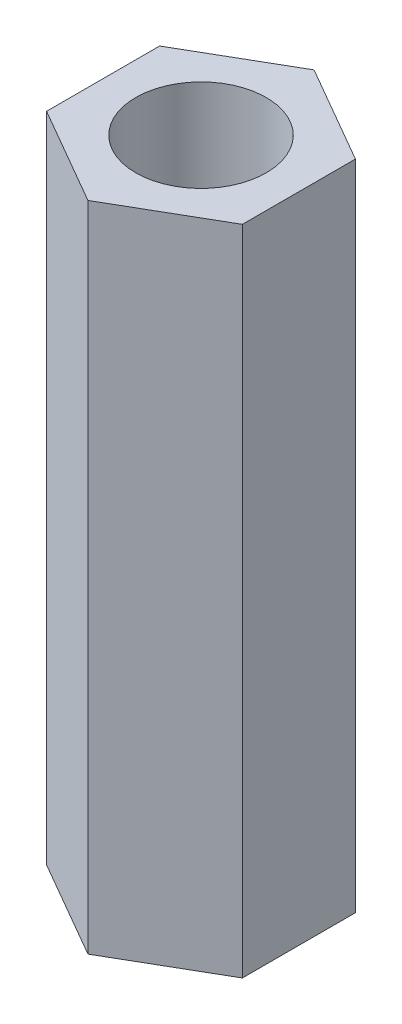
ISO-10303-21;
HEADER;
FILE_DESCRIPTION(('STEP AP214'),'2;1');
FILE_NAME('part.step','',(''),(''),'','','');
FILE_SCHEMA(('AUTOMOTIVE_DESIGN { 1 0 10303 214 1 1 1 1 }'));
ENDSEC;
DATA;
#1=APPLICATION_CONTEXT('core data for automotive mechanical design processes');
#2=APPLICATION_PROTOCOL_DEFINITION('international standard','automotive_design',2000,#1);
#3=PRODUCT_CONTEXT('',#1,'mechanical');
#4=PRODUCT('Part','Part','',(#3));
#5=PRODUCT_RELATED_PRODUCT_CATEGORY('part','',(#4));
#6=PRODUCT_DEFINITION_FORMATION('','',#4);
#7=PRODUCT_DEFINITION_CONTEXT('part definition',#1,'design');
#8=PRODUCT_DEFINITION('design','',#6,#7);
#9=PRODUCT_DEFINITION_SHAPE('','',#8);
#10=(LENGTH_UNIT() NAMED_UNIT(*) SI_UNIT(.MILLI.,.METRE.));
#11=(NAMED_UNIT(*) PLANE_ANGLE_UNIT() SI_UNIT($,.RADIAN.));
#12=(NAMED_UNIT(*) SI_UNIT($,.STERADIAN.) SOLID_ANGLE_UNIT());
#13=UNCERTAINTY_MEASURE_WITH_UNIT(LENGTH_MEASURE(1.E-05),#10,'distance_accuracy_value','');
#14=(GEOMETRIC_REPRESENTATION_CONTEXT(3) GLOBAL_UNCERTAINTY_ASSIGNED_CONTEXT((#13)) GLOBAL_UNIT_ASSIGNED_CONTEXT((#10,
#11,#12)) REPRESENTATION_CONTEXT('',''));
#15=CARTESIAN_POINT('',(0.,0.,0.));
#16=DIRECTION('',(0.,0.,1.));
#17=DIRECTION('',(1.,0.,0.));
#18=AXIS2_PLACEMENT_3D('',#15,#16,#17);
#19=CARTESIAN_POINT('',(0.,15.,0.));
#20=DIRECTION('',(0.,1.,0.));
#21=DIRECTION('',(0.,0.,1.));
#22=AXIS2_PLACEMENT_3D('',#19,#20,#21);
#23=PLANE('',#22);
#24=DIRECTION('',(0.866025403784438,0.,0.500000000000001));
#25=VECTOR('',#24,1.);
#26=CARTESIAN_POINT('',(-2.24999999999999,15.,1.29903810567666));
#27=LINE('',#26,#25);
#28=CARTESIAN_POINT('',(-2.24999999999999,15.,1.29903810567666));
#29=VERTEX_POINT('',#28);
#30=CARTESIAN_POINT('',(0.,15.,2.59807621135331));
#31=VERTEX_POINT('',#30);
#32=EDGE_CURVE('E135',#29,#31,#27,.T.);
#33=ORIENTED_EDGE('',*,*,#32,.T.);
#34=DIRECTION('',(0.866025403784439,0.,-0.5));
#35=VECTOR('',#34,1.);
#36=CARTESIAN_POINT('',(0.,15.,2.59807621135331));
#37=LINE('',#36,#35);
#38=CARTESIAN_POINT('',(2.25,15.,1.29903810567666));
#39=VERTEX_POINT('',#38);
#40=EDGE_CURVE('E93',#31,#39,#37,.T.);
#41=ORIENTED_EDGE('',*,*,#40,.T.);
#42=DIRECTION('',(0.,0.,-1.));
#43=VECTOR('',#42,1.);
#44=CARTESIAN_POINT('',(2.25,15.,1.29903810567666));
#45=LINE('',#44,#43);
#46=CARTESIAN_POINT('',(2.25,15.,-1.29903810567666));
#47=VERTEX_POINT('',#46);
#48=EDGE_CURVE('E106',#39,#47,#45,.T.);
#49=ORIENTED_EDGE('',*,*,#48,.T.);
#50=DIRECTION('',(-0.866025403784439,0.,-0.5));
#51=VECTOR('',#50,1.);
#52=CARTESIAN_POINT('',(2.25,15.,-1.29903810567666));
#53=LINE('',#52,#51);
#54=CARTESIAN_POINT('',(0.,15.,-2.59807621135332));
#55=VERTEX_POINT('',#54);
#56=EDGE_CURVE('E100',#47,#55,#53,.T.);
#57=ORIENTED_EDGE('',*,*,#56,.T.);
#58=DIRECTION('',(-0.866025403784438,0.,0.5));
#59=VECTOR('',#58,1.);
#60=CARTESIAN_POINT('',(0.,15.,-2.59807621135332));
#61=LINE('',#60,#59);
#62=CARTESIAN_POINT('',(-2.24999999999999,15.,-1.29903810567667));
#63=VERTEX_POINT('',#62);
#64=EDGE_CURVE('E104',#55,#63,#61,.T.);
#65=ORIENTED_EDGE('',*,*,#64,.T.);
#66=DIRECTION('',(0.,0.,1.));
#67=VECTOR('',#66,1.);
#68=CARTESIAN_POINT('',(-2.24999999999999,15.,-1.29903810567667));
#69=LINE('',#68,#67);
#70=EDGE_CURVE('E56',#63,#29,#69,.T.);
#71=ORIENTED_EDGE('',*,*,#70,.T.);
#72=EDGE_LOOP('',(#33,#41,#49,#57,#65,#71));
#73=FACE_BOUND('',#72,.T.);
#74=CARTESIAN_POINT('',(0.,15.,0.));
#75=DIRECTION('',(0.,1.,0.));
#76=DIRECTION('',(0.,0.,1.));
#77=AXIS2_PLACEMENT_3D('',#74,#75,#76);
#78=CIRCLE('',#77,1.5);
#79=CARTESIAN_POINT('',(0.,15.,1.5));
#80=VERTEX_POINT('',#79);
#81=EDGE_CURVE('E128',#80,#80,#78,.T.);
#82=ORIENTED_EDGE('',*,*,#81,.F.);
#83=EDGE_LOOP('',(#82));
#84=FACE_BOUND('',#83,.T.);
#85=ADVANCED_FACE('F39',(#73,#84),#23,.T.);
#86=CARTESIAN_POINT('',(0.,0.,0.));
#87=DIRECTION('',(0.,1.,0.));
#88=DIRECTION('',(0.,0.,1.));
#89=AXIS2_PLACEMENT_3D('',#86,#87,#88);
#90=PLANE('',#89);
#91=DIRECTION('',(0.866025403784438,0.,0.500000000000001));
#92=VECTOR('',#91,1.);
#93=CARTESIAN_POINT('',(-2.24999999999999,0.,1.29903810567666));
#94=LINE('',#93,#92);
#95=CARTESIAN_POINT('',(-2.24999999999999,0.,1.29903810567666));
#96=VERTEX_POINT('',#95);
#97=CARTESIAN_POINT('',(0.,0.,2.59807621135331));
#98=VERTEX_POINT('',#97);
#99=EDGE_CURVE('E124',#96,#98,#94,.T.);
#100=ORIENTED_EDGE('',*,*,#99,.F.);
#101=DIRECTION('',(0.,0.,1.));
#102=VECTOR('',#101,1.);
#103=CARTESIAN_POINT('',(-2.24999999999999,0.,-1.29903810567667));
#104=LINE('',#103,#102);
#105=CARTESIAN_POINT('',(-2.24999999999999,0.,-1.29903810567667));
#106=VERTEX_POINT('',#105);
#107=EDGE_CURVE('E85',#106,#96,#104,.T.);
#108=ORIENTED_EDGE('',*,*,#107,.F.);
#109=DIRECTION('',(-0.866025403784438,0.,0.5));
#110=VECTOR('',#109,1.);
#111=CARTESIAN_POINT('',(0.,0.,-2.59807621135332));
#112=LINE('',#111,#110);
#113=CARTESIAN_POINT('',(0.,0.,-2.59807621135332));
#114=VERTEX_POINT('',#113);
#115=EDGE_CURVE('E79',#114,#106,#112,.T.);
#116=ORIENTED_EDGE('',*,*,#115,.F.);
#117=DIRECTION('',(-0.866025403784439,0.,-0.5));
#118=VECTOR('',#117,1.);
#119=CARTESIAN_POINT('',(2.25,0.,-1.29903810567666));
#120=LINE('',#119,#118);
#121=CARTESIAN_POINT('',(2.25,0.,-1.29903810567666));
#122=VERTEX_POINT('',#121);
#123=EDGE_CURVE('E114',#122,#114,#120,.T.);
#124=ORIENTED_EDGE('',*,*,#123,.F.);
#125=DIRECTION('',(0.,0.,-1.));
#126=VECTOR('',#125,1.);
#127=CARTESIAN_POINT('',(2.25,0.,1.29903810567666));
#128=LINE('',#127,#126);
#129=CARTESIAN_POINT('',(2.25,0.,1.29903810567666));
#130=VERTEX_POINT('',#129);
#131=EDGE_CURVE('E130',#130,#122,#128,.T.);
#132=ORIENTED_EDGE('',*,*,#131,.F.);
#133=DIRECTION('',(0.866025403784439,0.,-0.5));
#134=VECTOR('',#133,1.);
#135=CARTESIAN_POINT('',(0.,0.,2.59807621135331));
#136=LINE('',#135,#134);
#137=EDGE_CURVE('E127',#98,#130,#136,.T.);
#138=ORIENTED_EDGE('',*,*,#137,.F.);
#139=EDGE_LOOP('',(#100,#108,#116,#124,#132,#138));
#140=FACE_BOUND('',#139,.T.);
#141=CARTESIAN_POINT('',(0.,0.,0.));
#142=DIRECTION('',(0.,1.,0.));
#143=DIRECTION('',(0.,0.,1.));
#144=AXIS2_PLACEMENT_3D('',#141,#142,#143);
#145=CIRCLE('',#144,1.5);
#146=CARTESIAN_POINT('',(0.,0.,1.5));
#147=VERTEX_POINT('',#146);
#148=EDGE_CURVE('E228',#147,#147,#145,.T.);
#149=ORIENTED_EDGE('',*,*,#148,.T.);
#150=EDGE_LOOP('',(#149));
#151=FACE_BOUND('',#150,.T.);
#152=ADVANCED_FACE('F144',(#140,#151),#90,.F.);
#153=CARTESIAN_POINT('',(-2.24999999999999,15.,1.29903810567666));
#154=DIRECTION('',(0.500000000000001,0.,-0.866025403784438));
#155=DIRECTION('',(-0.866025403784438,0.,-0.500000000000001));
#156=AXIS2_PLACEMENT_3D('',#153,#154,#155);
#157=PLANE('',#156);
#158=ORIENTED_EDGE('',*,*,#99,.T.);
#159=DIRECTION('',(0.,-1.,0.));
#160=VECTOR('',#159,1.);
#161=CARTESIAN_POINT('',(0.,15.,2.59807621135331));
#162=LINE('',#161,#160);
#163=EDGE_CURVE('E11',#31,#98,#162,.T.);
#164=ORIENTED_EDGE('',*,*,#163,.F.);
#165=ORIENTED_EDGE('',*,*,#32,.F.);
#166=DIRECTION('',(0.,-1.,0.));
#167=VECTOR('',#166,1.);
#168=CARTESIAN_POINT('',(-2.24999999999999,15.,1.29903810567666));
#169=LINE('',#168,#167);
#170=EDGE_CURVE('E120',#29,#96,#169,.T.);
#171=ORIENTED_EDGE('',*,*,#170,.T.);
#172=EDGE_LOOP('',(#158,#164,#165,#171));
#173=FACE_BOUND('',#172,.T.);
#174=ADVANCED_FACE('F41',(#173),#157,.F.);
#175=CARTESIAN_POINT('',(0.,15.,2.59807621135331));
#176=DIRECTION('',(-0.5,0.,-0.866025403784439));
#177=DIRECTION('',(-0.866025403784439,0.,0.5));
#178=AXIS2_PLACEMENT_3D('',#175,#176,#177);
#179=PLANE('',#178);
#180=ORIENTED_EDGE('',*,*,#137,.T.);
#181=DIRECTION('',(0.,-1.,0.));
#182=VECTOR('',#181,1.);
#183=CARTESIAN_POINT('',(2.25,15.,1.29903810567666));
#184=LINE('',#183,#182);
#185=EDGE_CURVE('E48',#39,#130,#184,.T.);
#186=ORIENTED_EDGE('',*,*,#185,.F.);
#187=ORIENTED_EDGE('',*,*,#40,.F.);
#188=ORIENTED_EDGE('',*,*,#163,.T.);
#189=EDGE_LOOP('',(#180,#186,#187,#188));
#190=FACE_BOUND('',#189,.T.);
#191=ADVANCED_FACE('F169',(#190),#179,.F.);
#192=CARTESIAN_POINT('',(2.25,15.,1.29903810567666));
#193=DIRECTION('',(-1.,0.,0.));
#194=DIRECTION('',(0.,0.,1.));
#195=AXIS2_PLACEMENT_3D('',#192,#193,#194);
#196=PLANE('',#195);
#197=ORIENTED_EDGE('',*,*,#131,.T.);
#198=DIRECTION('',(0.,-1.,0.));
#199=VECTOR('',#198,1.);
#200=CARTESIAN_POINT('',(2.25,15.,-1.29903810567666));
#201=LINE('',#200,#199);
#202=EDGE_CURVE('E115',#47,#122,#201,.T.);
#203=ORIENTED_EDGE('',*,*,#202,.F.);
#204=ORIENTED_EDGE('',*,*,#48,.F.);
#205=ORIENTED_EDGE('',*,*,#185,.T.);
#206=EDGE_LOOP('',(#197,#203,#204,#205));
#207=FACE_BOUND('',#206,.T.);
#208=ADVANCED_FACE('F141',(#207),#196,.F.);
#209=CARTESIAN_POINT('',(2.25,15.,-1.29903810567666));
#210=DIRECTION('',(-0.5,0.,0.866025403784439));
#211=DIRECTION('',(0.866025403784439,0.,0.5));
#212=AXIS2_PLACEMENT_3D('',#209,#210,#211);
#213=PLANE('',#212);
#214=ORIENTED_EDGE('',*,*,#123,.T.);
#215=DIRECTION('',(0.,-1.,0.));
#216=VECTOR('',#215,1.);
#217=CARTESIAN_POINT('',(0.,15.,-2.59807621135332));
#218=LINE('',#217,#216);
#219=EDGE_CURVE('E111',#55,#114,#218,.T.);
#220=ORIENTED_EDGE('',*,*,#219,.F.);
#221=ORIENTED_EDGE('',*,*,#56,.F.);
#222=ORIENTED_EDGE('',*,*,#202,.T.);
#223=EDGE_LOOP('',(#214,#220,#221,#222));
#224=FACE_BOUND('',#223,.T.);
#225=ADVANCED_FACE('F112',(#224),#213,.F.);
#226=CARTESIAN_POINT('',(0.,15.,-2.59807621135332));
#227=DIRECTION('',(0.5,0.,0.866025403784438));
#228=DIRECTION('',(0.866025403784439,0.,-0.5));
#229=AXIS2_PLACEMENT_3D('',#226,#227,#228);
#230=PLANE('',#229);
#231=ORIENTED_EDGE('',*,*,#115,.T.);
#232=DIRECTION('',(0.,-1.,0.));
#233=VECTOR('',#232,1.);
#234=CARTESIAN_POINT('',(-2.24999999999999,15.,-1.29903810567667));
#235=LINE('',#234,#233);
#236=EDGE_CURVE('E116',#63,#106,#235,.T.);
#237=ORIENTED_EDGE('',*,*,#236,.F.);
#238=ORIENTED_EDGE('',*,*,#64,.F.);
#239=ORIENTED_EDGE('',*,*,#219,.T.);
#240=EDGE_LOOP('',(#231,#237,#238,#239));
#241=FACE_BOUND('',#240,.T.);
#242=ADVANCED_FACE('F118',(#241),#230,.F.);
#243=CARTESIAN_POINT('',(-2.24999999999999,15.,-1.29903810567667));
#244=DIRECTION('',(1.,0.,0.));
#245=DIRECTION('',(0.,0.,-1.));
#246=AXIS2_PLACEMENT_3D('',#243,#244,#245);
#247=PLANE('',#246);
#248=ORIENTED_EDGE('',*,*,#107,.T.);
#249=ORIENTED_EDGE('',*,*,#170,.F.);
#250=ORIENTED_EDGE('',*,*,#70,.F.);
#251=ORIENTED_EDGE('',*,*,#236,.T.);
#252=EDGE_LOOP('',(#248,#249,#250,#251));
#253=FACE_BOUND('',#252,.T.);
#254=ADVANCED_FACE('F149',(#253),#247,.F.);
#255=CARTESIAN_POINT('',(0.,15.,0.));
#256=DIRECTION('',(0.,-1.,0.));
#257=DIRECTION('',(0.,0.,-1.));
#258=AXIS2_PLACEMENT_3D('',#255,#256,#257);
#259=CYLINDRICAL_SURFACE('',#258,1.5);
#260=ORIENTED_EDGE('',*,*,#81,.T.);
#261=EDGE_LOOP('',(#260));
#262=FACE_BOUND('',#261,.T.);
#263=ORIENTED_EDGE('',*,*,#148,.F.);
#264=EDGE_LOOP('',(#263));
#265=FACE_BOUND('',#264,.T.);
#266=ADVANCED_FACE('F151',(#262,#265),#259,.F.);
#267=CLOSED_SHELL('',(#85,#152,#174,#191,#208,#225,#242,#254,#266));
#268=MANIFOLD_SOLID_BREP('B2',#267);
#269=ADVANCED_BREP_SHAPE_REPRESENTATION('',(#18,#268),#14);
#270=SHAPE_DEFINITION_REPRESENTATION(#9,#269);
ENDSEC;
END-ISO-10303-21;
